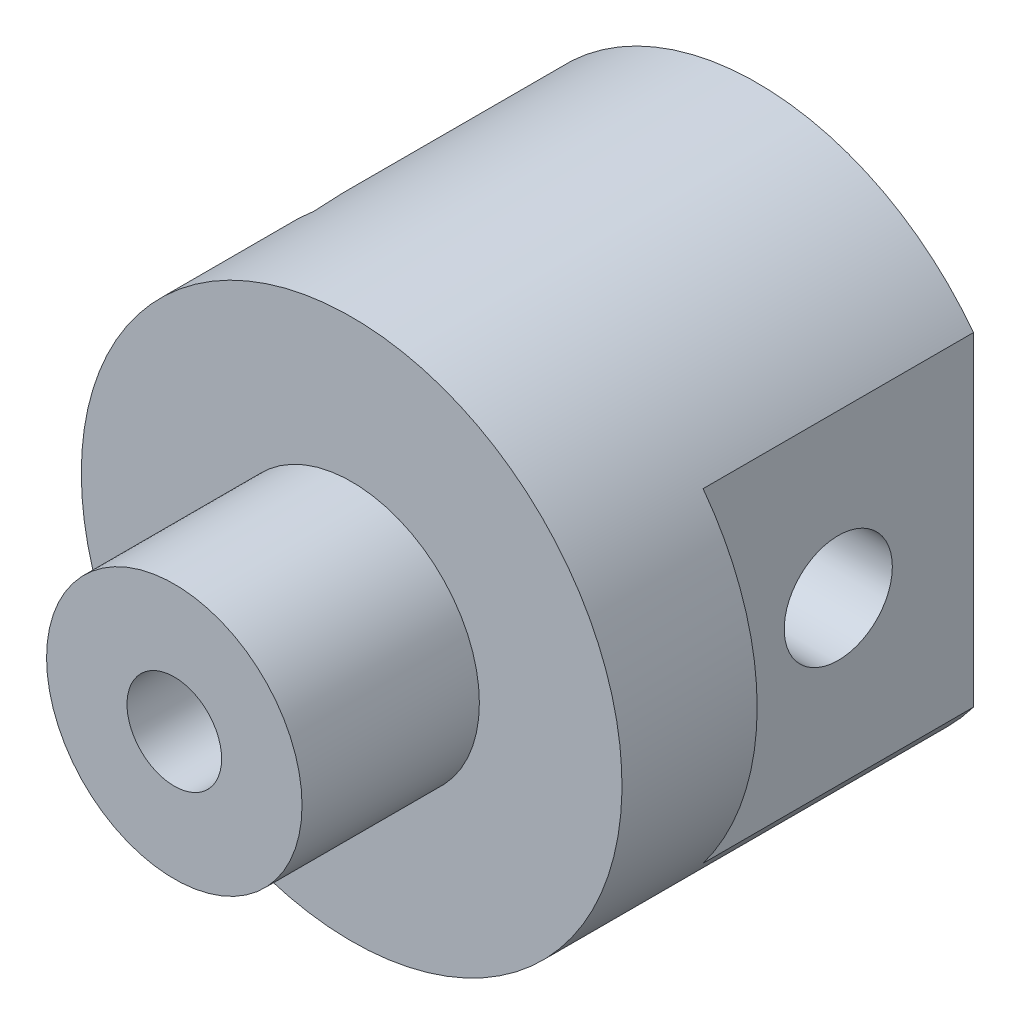
ISO-10303-21;
HEADER;
FILE_DESCRIPTION(('STEP AP214'),'2;1');
FILE_NAME('part.step','',(''),(''),'','','');
FILE_SCHEMA(('AUTOMOTIVE_DESIGN { 1 0 10303 214 1 1 1 1 }'));
ENDSEC;
DATA;
#1=APPLICATION_CONTEXT('core data for automotive mechanical design processes');
#2=APPLICATION_PROTOCOL_DEFINITION('international standard','automotive_design',2000,#1);
#3=PRODUCT_CONTEXT('',#1,'mechanical');
#4=PRODUCT('Part','Part','',(#3));
#5=PRODUCT_RELATED_PRODUCT_CATEGORY('part','',(#4));
#6=PRODUCT_DEFINITION_FORMATION('','',#4);
#7=PRODUCT_DEFINITION_CONTEXT('part definition',#1,'design');
#8=PRODUCT_DEFINITION('design','',#6,#7);
#9=PRODUCT_DEFINITION_SHAPE('','',#8);
#10=(LENGTH_UNIT() NAMED_UNIT(*) SI_UNIT(.MILLI.,.METRE.));
#11=(NAMED_UNIT(*) PLANE_ANGLE_UNIT() SI_UNIT($,.RADIAN.));
#12=(NAMED_UNIT(*) SI_UNIT($,.STERADIAN.) SOLID_ANGLE_UNIT());
#13=UNCERTAINTY_MEASURE_WITH_UNIT(LENGTH_MEASURE(1.E-05),#10,'distance_accuracy_value','');
#14=(GEOMETRIC_REPRESENTATION_CONTEXT(3) GLOBAL_UNCERTAINTY_ASSIGNED_CONTEXT((#13)) GLOBAL_UNIT_ASSIGNED_CONTEXT((#10,
#11,#12)) REPRESENTATION_CONTEXT('',''));
#15=CARTESIAN_POINT('',(0.,0.,0.));
#16=DIRECTION('',(0.,0.,1.));
#17=DIRECTION('',(1.,0.,0.));
#18=AXIS2_PLACEMENT_3D('',#15,#16,#17);
#19=CARTESIAN_POINT('',(0.,0.,-21.56));
#20=DIRECTION('',(0.,0.,1.));
#21=DIRECTION('',(1.,0.,0.));
#22=AXIS2_PLACEMENT_3D('',#19,#20,#21);
#23=CYLINDRICAL_SURFACE('',#22,10.);
#24=CARTESIAN_POINT('',(0.,0.,-6.56));
#25=DIRECTION('',(0.,0.,-1.));
#26=DIRECTION('',(-1.,0.,0.));
#27=AXIS2_PLACEMENT_3D('',#24,#25,#26);
#28=CIRCLE('',#27,10.);
#29=CARTESIAN_POINT('',(-10.,0.,-6.56));
#30=VERTEX_POINT('',#29);
#31=EDGE_CURVE('E112',#30,#30,#28,.T.);
#32=ORIENTED_EDGE('',*,*,#31,.T.);
#33=EDGE_LOOP('',(#32));
#34=FACE_BOUND('',#33,.T.);
#35=CARTESIAN_POINT('',(0.,0.,-11.56));
#36=DIRECTION('',(0.,0.,-1.));
#37=DIRECTION('',(0.,1.,0.));
#38=AXIS2_PLACEMENT_3D('',#35,#36,#37);
#39=CIRCLE('',#38,10.);
#40=CARTESIAN_POINT('',(8.,6.,-11.56));
#41=VERTEX_POINT('',#40);
#42=CARTESIAN_POINT('',(8.,-6.,-11.56));
#43=VERTEX_POINT('',#42);
#44=EDGE_CURVE('E11',#41,#43,#39,.T.);
#45=ORIENTED_EDGE('',*,*,#44,.F.);
#46=DIRECTION('',(0.,0.,-1.));
#47=VECTOR('',#46,1.);
#48=CARTESIAN_POINT('',(8.,6.,0.605525060596444));
#49=LINE('',#48,#47);
#50=CARTESIAN_POINT('',(8.,6.,-21.56));
#51=VERTEX_POINT('',#50);
#52=EDGE_CURVE('E89',#41,#51,#49,.T.);
#53=ORIENTED_EDGE('',*,*,#52,.T.);
#54=CARTESIAN_POINT('',(0.,0.,-21.56));
#55=DIRECTION('',(0.,0.,-1.));
#56=DIRECTION('',(-1.,0.,0.));
#57=AXIS2_PLACEMENT_3D('',#54,#55,#56);
#58=CIRCLE('',#57,10.);
#59=CARTESIAN_POINT('',(-8.66025403784439,5.,-21.56));
#60=VERTEX_POINT('',#59);
#61=EDGE_CURVE('E98',#60,#51,#58,.T.);
#62=ORIENTED_EDGE('',*,*,#61,.F.);
#63=CARTESIAN_POINT('',(0.,0.,-40.220254037844));
#64=DIRECTION('',(0.,-0.965925826289067,0.258819045102525));
#65=DIRECTION('',(0.,0.258819045102525,0.965925826289067));
#66=AXIS2_PLACEMENT_3D('',#63,#64,#65);
#67=ELLIPSE('',#66,38.637033051562,10.);
#68=CARTESIAN_POINT('',(-6.40510763254122,7.67949192431128,-11.56));
#69=VERTEX_POINT('',#68);
#70=EDGE_CURVE('E115',#69,#60,#67,.T.);
#71=ORIENTED_EDGE('',*,*,#70,.F.);
#72=CARTESIAN_POINT('',(0.,0.,-11.56));
#73=DIRECTION('',(0.,0.,-1.));
#74=DIRECTION('',(0.,1.,0.));
#75=AXIS2_PLACEMENT_3D('',#72,#73,#74);
#76=CIRCLE('',#75,10.);
#77=CARTESIAN_POINT('',(-6.40510763254122,-7.67949192431128,-11.56));
#78=VERTEX_POINT('',#77);
#79=EDGE_CURVE('E42',#78,#69,#76,.T.);
#80=ORIENTED_EDGE('',*,*,#79,.F.);
#81=CARTESIAN_POINT('',(0.,0.,-40.220254037844));
#82=DIRECTION('',(0.,0.965925826289067,0.258819045102526));
#83=DIRECTION('',(0.,-0.258819045102526,0.965925826289067));
#84=AXIS2_PLACEMENT_3D('',#81,#82,#83);
#85=ELLIPSE('',#84,38.637033051562,10.);
#86=CARTESIAN_POINT('',(-8.66025403784439,-5.,-21.56));
#87=VERTEX_POINT('',#86);
#88=EDGE_CURVE('E133',#87,#78,#85,.T.);
#89=ORIENTED_EDGE('',*,*,#88,.F.);
#90=CARTESIAN_POINT('',(8.,-6.,-21.56));
#91=VERTEX_POINT('',#90);
#92=EDGE_CURVE('E107',#91,#87,#58,.T.);
#93=ORIENTED_EDGE('',*,*,#92,.F.);
#94=DIRECTION('',(0.,0.,-1.));
#95=VECTOR('',#94,1.);
#96=CARTESIAN_POINT('',(8.,-6.,0.605525060596444));
#97=LINE('',#96,#95);
#98=EDGE_CURVE('E49',#43,#91,#97,.T.);
#99=ORIENTED_EDGE('',*,*,#98,.F.);
#100=EDGE_LOOP('',(#45,#53,#62,#71,#80,#89,#93,#99));
#101=FACE_BOUND('',#100,.T.);
#102=ADVANCED_FACE('F33',(#34,#101),#23,.T.);
#103=CARTESIAN_POINT('',(0.,0.,-21.56));
#104=DIRECTION('',(0.,0.,-1.));
#105=DIRECTION('',(-1.,0.,0.));
#106=AXIS2_PLACEMENT_3D('',#103,#104,#105);
#107=PLANE('',#106);
#108=DIRECTION('',(0.,1.,0.));
#109=VECTOR('',#108,1.);
#110=CARTESIAN_POINT('',(8.,6.,-21.56));
#111=LINE('',#110,#109);
#112=EDGE_CURVE('E86',#91,#51,#111,.T.);
#113=ORIENTED_EDGE('',*,*,#112,.F.);
#114=ORIENTED_EDGE('',*,*,#92,.T.);
#115=DIRECTION('',(-1.,0.,0.));
#116=VECTOR('',#115,1.);
#117=CARTESIAN_POINT('',(5.,-5.,-21.56));
#118=LINE('',#117,#116);
#119=CARTESIAN_POINT('',(5.,-5.,-21.56));
#120=VERTEX_POINT('',#119);
#121=EDGE_CURVE('E139',#120,#87,#118,.T.);
#122=ORIENTED_EDGE('',*,*,#121,.F.);
#123=DIRECTION('',(0.,1.,0.));
#124=VECTOR('',#123,1.);
#125=CARTESIAN_POINT('',(5.,-5.,-21.56));
#126=LINE('',#125,#124);
#127=CARTESIAN_POINT('',(5.,5.,-21.56));
#128=VERTEX_POINT('',#127);
#129=EDGE_CURVE('E142',#120,#128,#126,.T.);
#130=ORIENTED_EDGE('',*,*,#129,.T.);
#131=DIRECTION('',(-1.,0.,0.));
#132=VECTOR('',#131,1.);
#133=CARTESIAN_POINT('',(5.,5.,-21.56));
#134=LINE('',#133,#132);
#135=EDGE_CURVE('E105',#128,#60,#134,.T.);
#136=ORIENTED_EDGE('',*,*,#135,.T.);
#137=ORIENTED_EDGE('',*,*,#61,.T.);
#138=EDGE_LOOP('',(#113,#114,#122,#130,#136,#137));
#139=FACE_BOUND('',#138,.T.);
#140=ADVANCED_FACE('F103',(#139),#107,.T.);
#141=CARTESIAN_POINT('',(0.,0.,-6.56));
#142=DIRECTION('',(0.,0.,1.));
#143=DIRECTION('',(1.,0.,0.));
#144=AXIS2_PLACEMENT_3D('',#141,#142,#143);
#145=CYLINDRICAL_SURFACE('',#144,4.725);
#146=CARTESIAN_POINT('',(0.,0.,-6.56));
#147=DIRECTION('',(0.,0.,1.));
#148=DIRECTION('',(1.,0.,0.));
#149=AXIS2_PLACEMENT_3D('',#146,#147,#148);
#150=CIRCLE('',#149,4.725);
#151=CARTESIAN_POINT('',(4.725,0.,-6.56));
#152=VERTEX_POINT('',#151);
#153=EDGE_CURVE('E106',#152,#152,#150,.T.);
#154=ORIENTED_EDGE('',*,*,#153,.T.);
#155=EDGE_LOOP('',(#154));
#156=FACE_BOUND('',#155,.T.);
#157=CARTESIAN_POINT('',(0.,0.,0.));
#158=DIRECTION('',(0.,0.,1.));
#159=DIRECTION('',(1.,0.,0.));
#160=AXIS2_PLACEMENT_3D('',#157,#158,#159);
#161=CIRCLE('',#160,4.725);
#162=CARTESIAN_POINT('',(4.725,0.,0.));
#163=VERTEX_POINT('',#162);
#164=EDGE_CURVE('E110',#163,#163,#161,.T.);
#165=ORIENTED_EDGE('',*,*,#164,.F.);
#166=EDGE_LOOP('',(#165));
#167=FACE_BOUND('',#166,.T.);
#168=ADVANCED_FACE('F35',(#156,#167),#145,.T.);
#169=CARTESIAN_POINT('',(0.,0.,0.));
#170=DIRECTION('',(0.,0.,1.));
#171=DIRECTION('',(1.,0.,0.));
#172=AXIS2_PLACEMENT_3D('',#169,#170,#171);
#173=PLANE('',#172);
#174=CARTESIAN_POINT('',(0.,0.,0.));
#175=DIRECTION('',(0.,0.,1.));
#176=DIRECTION('',(1.,0.,0.));
#177=AXIS2_PLACEMENT_3D('',#174,#175,#176);
#178=CIRCLE('',#177,1.75);
#179=CARTESIAN_POINT('',(1.75,0.,0.));
#180=VERTEX_POINT('',#179);
#181=EDGE_CURVE('E156',#180,#180,#178,.T.);
#182=ORIENTED_EDGE('',*,*,#181,.F.);
#183=EDGE_LOOP('',(#182));
#184=FACE_BOUND('',#183,.T.);
#185=ORIENTED_EDGE('',*,*,#164,.T.);
#186=EDGE_LOOP('',(#185));
#187=FACE_BOUND('',#186,.T.);
#188=ADVANCED_FACE('F176',(#184,#187),#173,.T.);
#189=CARTESIAN_POINT('',(0.,0.,-6.56));
#190=DIRECTION('',(0.,0.,-1.));
#191=DIRECTION('',(-1.,0.,0.));
#192=AXIS2_PLACEMENT_3D('',#189,#190,#191);
#193=PLANE('',#192);
#194=ORIENTED_EDGE('',*,*,#153,.F.);
#195=EDGE_LOOP('',(#194));
#196=FACE_BOUND('',#195,.T.);
#197=ORIENTED_EDGE('',*,*,#31,.F.);
#198=EDGE_LOOP('',(#197));
#199=FACE_BOUND('',#198,.T.);
#200=ADVANCED_FACE('F166',(#196,#199),#193,.F.);
#201=CARTESIAN_POINT('',(5.,-7.67949192431128,-11.56));
#202=DIRECTION('',(0.,0.,-1.));
#203=DIRECTION('',(0.,1.,0.));
#204=AXIS2_PLACEMENT_3D('',#201,#202,#203);
#205=PLANE('',#204);
#206=CARTESIAN_POINT('',(0.,0.,-11.56));
#207=DIRECTION('',(0.,0.,-1.));
#208=DIRECTION('',(0.,1.,0.));
#209=AXIS2_PLACEMENT_3D('',#206,#207,#208);
#210=CIRCLE('',#209,1.75);
#211=CARTESIAN_POINT('',(0.,1.75,-11.56));
#212=VERTEX_POINT('',#211);
#213=EDGE_CURVE('E37',#212,#212,#210,.T.);
#214=ORIENTED_EDGE('',*,*,#213,.F.);
#215=EDGE_LOOP('',(#214));
#216=FACE_BOUND('',#215,.T.);
#217=ORIENTED_EDGE('',*,*,#79,.T.);
#218=DIRECTION('',(-1.,0.,0.));
#219=VECTOR('',#218,1.);
#220=CARTESIAN_POINT('',(5.,7.67949192431128,-11.56));
#221=LINE('',#220,#219);
#222=CARTESIAN_POINT('',(5.,7.67949192431128,-11.56));
#223=VERTEX_POINT('',#222);
#224=EDGE_CURVE('E127',#223,#69,#221,.T.);
#225=ORIENTED_EDGE('',*,*,#224,.F.);
#226=DIRECTION('',(0.,-1.,0.));
#227=VECTOR('',#226,1.);
#228=CARTESIAN_POINT('',(5.,-7.67949192431128,-11.56));
#229=LINE('',#228,#227);
#230=CARTESIAN_POINT('',(5.,-7.67949192431128,-11.56));
#231=VERTEX_POINT('',#230);
#232=EDGE_CURVE('E146',#223,#231,#229,.T.);
#233=ORIENTED_EDGE('',*,*,#232,.T.);
#234=DIRECTION('',(-1.,0.,0.));
#235=VECTOR('',#234,1.);
#236=CARTESIAN_POINT('',(5.,-7.67949192431128,-11.56));
#237=LINE('',#236,#235);
#238=EDGE_CURVE('E129',#231,#78,#237,.T.);
#239=ORIENTED_EDGE('',*,*,#238,.T.);
#240=EDGE_LOOP('',(#217,#225,#233,#239));
#241=FACE_BOUND('',#240,.T.);
#242=ADVANCED_FACE('F126',(#216,#241),#205,.T.);
#243=CARTESIAN_POINT('',(5.,7.67949192431128,-11.56));
#244=DIRECTION('',(0.,-0.965925826289067,0.258819045102525));
#245=DIRECTION('',(0.,-0.258819045102525,-0.965925826289067));
#246=AXIS2_PLACEMENT_3D('',#243,#244,#245);
#247=PLANE('',#246);
#248=ORIENTED_EDGE('',*,*,#70,.T.);
#249=ORIENTED_EDGE('',*,*,#135,.F.);
#250=DIRECTION('',(0.,0.258819045102525,0.965925826289067));
#251=VECTOR('',#250,1.);
#252=CARTESIAN_POINT('',(5.,7.67949192431128,-11.56));
#253=LINE('',#252,#251);
#254=EDGE_CURVE('E57',#128,#223,#253,.T.);
#255=ORIENTED_EDGE('',*,*,#254,.T.);
#256=ORIENTED_EDGE('',*,*,#224,.T.);
#257=EDGE_LOOP('',(#248,#249,#255,#256));
#258=FACE_BOUND('',#257,.T.);
#259=ADVANCED_FACE('F132',(#258),#247,.T.);
#260=CARTESIAN_POINT('',(5.,-7.67949192431128,-11.56));
#261=DIRECTION('',(0.,0.965925826289067,0.258819045102526));
#262=DIRECTION('',(0.,-0.258819045102526,0.965925826289067));
#263=AXIS2_PLACEMENT_3D('',#260,#261,#262);
#264=PLANE('',#263);
#265=ORIENTED_EDGE('',*,*,#88,.T.);
#266=ORIENTED_EDGE('',*,*,#238,.F.);
#267=DIRECTION('',(0.,0.258819045102526,-0.965925826289067));
#268=VECTOR('',#267,1.);
#269=CARTESIAN_POINT('',(5.,-7.67949192431128,-11.56));
#270=LINE('',#269,#268);
#271=EDGE_CURVE('E144',#231,#120,#270,.T.);
#272=ORIENTED_EDGE('',*,*,#271,.T.);
#273=ORIENTED_EDGE('',*,*,#121,.T.);
#274=EDGE_LOOP('',(#265,#266,#272,#273));
#275=FACE_BOUND('',#274,.T.);
#276=ADVANCED_FACE('F173',(#275),#264,.T.);
#277=CARTESIAN_POINT('',(5.,0.,0.));
#278=DIRECTION('',(1.,0.,0.));
#279=DIRECTION('',(0.,0.,-1.));
#280=AXIS2_PLACEMENT_3D('',#277,#278,#279);
#281=PLANE('',#280);
#282=CARTESIAN_POINT('',(5.,0.,-16.56));
#283=DIRECTION('',(1.,0.,0.));
#284=DIRECTION('',(0.,0.,-1.));
#285=AXIS2_PLACEMENT_3D('',#282,#283,#284);
#286=CIRCLE('',#285,2.00000000000001);
#287=CARTESIAN_POINT('',(5.,0.,-18.56));
#288=VERTEX_POINT('',#287);
#289=EDGE_CURVE('E93',#288,#288,#286,.F.);
#290=ORIENTED_EDGE('',*,*,#289,.F.);
#291=EDGE_LOOP('',(#290));
#292=FACE_BOUND('',#291,.T.);
#293=ORIENTED_EDGE('',*,*,#254,.F.);
#294=ORIENTED_EDGE('',*,*,#129,.F.);
#295=ORIENTED_EDGE('',*,*,#271,.F.);
#296=ORIENTED_EDGE('',*,*,#232,.F.);
#297=EDGE_LOOP('',(#293,#294,#295,#296));
#298=FACE_BOUND('',#297,.T.);
#299=ADVANCED_FACE('F226',(#292,#298),#281,.F.);
#300=CARTESIAN_POINT('',(5.,-7.67949192431128,-11.56));
#301=DIRECTION('',(0.,0.,-1.));
#302=DIRECTION('',(0.,1.,0.));
#303=AXIS2_PLACEMENT_3D('',#300,#301,#302);
#304=PLANE('',#303);
#305=DIRECTION('',(0.,-1.,0.));
#306=VECTOR('',#305,1.);
#307=CARTESIAN_POINT('',(8.,6.,-11.56));
#308=LINE('',#307,#306);
#309=EDGE_CURVE('E100',#41,#43,#308,.T.);
#310=ORIENTED_EDGE('',*,*,#309,.F.);
#311=ORIENTED_EDGE('',*,*,#44,.T.);
#312=EDGE_LOOP('',(#310,#311));
#313=FACE_BOUND('',#312,.T.);
#314=ADVANCED_FACE('F232',(#313),#304,.T.);
#315=CARTESIAN_POINT('',(8.,6.,0.605525060596444));
#316=DIRECTION('',(-1.,0.,0.));
#317=DIRECTION('',(0.,0.,1.));
#318=AXIS2_PLACEMENT_3D('',#315,#316,#317);
#319=PLANE('',#318);
#320=CARTESIAN_POINT('',(8.,0.,-16.56));
#321=DIRECTION('',(1.,0.,0.));
#322=DIRECTION('',(0.,0.,-1.));
#323=AXIS2_PLACEMENT_3D('',#320,#321,#322);
#324=CIRCLE('',#323,2.00000000000001);
#325=CARTESIAN_POINT('',(8.,0.,-18.56));
#326=VERTEX_POINT('',#325);
#327=EDGE_CURVE('E153',#326,#326,#324,.T.);
#328=ORIENTED_EDGE('',*,*,#327,.F.);
#329=EDGE_LOOP('',(#328));
#330=FACE_BOUND('',#329,.T.);
#331=ORIENTED_EDGE('',*,*,#309,.T.);
#332=ORIENTED_EDGE('',*,*,#98,.T.);
#333=ORIENTED_EDGE('',*,*,#112,.T.);
#334=ORIENTED_EDGE('',*,*,#52,.F.);
#335=EDGE_LOOP('',(#331,#332,#333,#334));
#336=FACE_BOUND('',#335,.T.);
#337=ADVANCED_FACE('F88',(#330,#336),#319,.F.);
#338=CARTESIAN_POINT('',(-10.001,0.,-16.56));
#339=DIRECTION('',(1.,0.,0.));
#340=DIRECTION('',(0.,0.,-1.));
#341=AXIS2_PLACEMENT_3D('',#338,#339,#340);
#342=CYLINDRICAL_SURFACE('',#341,2.00000000000001);
#343=ORIENTED_EDGE('',*,*,#327,.T.);
#344=EDGE_LOOP('',(#343));
#345=FACE_BOUND('',#344,.T.);
#346=ORIENTED_EDGE('',*,*,#289,.T.);
#347=EDGE_LOOP('',(#346));
#348=FACE_BOUND('',#347,.T.);
#349=ADVANCED_FACE('F247',(#345,#348),#342,.F.);
#350=CARTESIAN_POINT('',(0.,0.,-21.56));
#351=DIRECTION('',(0.,0.,1.));
#352=DIRECTION('',(1.,0.,0.));
#353=AXIS2_PLACEMENT_3D('',#350,#351,#352);
#354=CYLINDRICAL_SURFACE('',#353,1.75);
#355=ORIENTED_EDGE('',*,*,#213,.T.);
#356=EDGE_LOOP('',(#355));
#357=FACE_BOUND('',#356,.T.);
#358=ORIENTED_EDGE('',*,*,#181,.T.);
#359=EDGE_LOOP('',(#358));
#360=FACE_BOUND('',#359,.T.);
#361=ADVANCED_FACE('F163',(#357,#360),#354,.F.);
#362=CLOSED_SHELL('',(#102,#140,#168,#188,#200,#242,#259,#276,#299,#314,#337,#349,#361));
#363=MANIFOLD_SOLID_BREP('B2',#362);
#364=ADVANCED_BREP_SHAPE_REPRESENTATION('',(#18,#363),#14);
#365=SHAPE_DEFINITION_REPRESENTATION(#9,#364);
ENDSEC;
END-ISO-10303-21;
